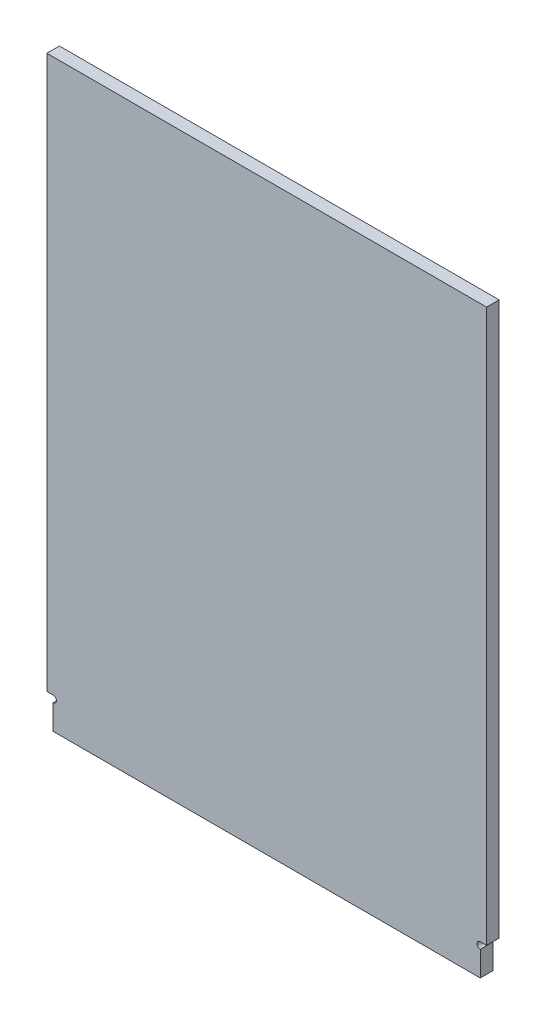
ISO-10303-21;
HEADER;
FILE_DESCRIPTION(('STEP AP214'),'2;1');
FILE_NAME('part.step','',(''),(''),'','','');
FILE_SCHEMA(('AUTOMOTIVE_DESIGN { 1 0 10303 214 1 1 1 1 }'));
ENDSEC;
DATA;
#1=APPLICATION_CONTEXT('core data for automotive mechanical design processes');
#2=APPLICATION_PROTOCOL_DEFINITION('international standard','automotive_design',2000,#1);
#3=PRODUCT_CONTEXT('',#1,'mechanical');
#4=PRODUCT('Part','Part','',(#3));
#5=PRODUCT_RELATED_PRODUCT_CATEGORY('part','',(#4));
#6=PRODUCT_DEFINITION_FORMATION('','',#4);
#7=PRODUCT_DEFINITION_CONTEXT('part definition',#1,'design');
#8=PRODUCT_DEFINITION('design','',#6,#7);
#9=PRODUCT_DEFINITION_SHAPE('','',#8);
#10=(LENGTH_UNIT() NAMED_UNIT(*) SI_UNIT(.MILLI.,.METRE.));
#11=(NAMED_UNIT(*) PLANE_ANGLE_UNIT() SI_UNIT($,.RADIAN.));
#12=(NAMED_UNIT(*) SI_UNIT($,.STERADIAN.) SOLID_ANGLE_UNIT());
#13=UNCERTAINTY_MEASURE_WITH_UNIT(LENGTH_MEASURE(1.E-05),#10,'distance_accuracy_value','');
#14=(GEOMETRIC_REPRESENTATION_CONTEXT(3) GLOBAL_UNCERTAINTY_ASSIGNED_CONTEXT((#13)) GLOBAL_UNIT_ASSIGNED_CONTEXT((#10,
#11,#12)) REPRESENTATION_CONTEXT('',''));
#15=CARTESIAN_POINT('',(0.,0.,0.));
#16=DIRECTION('',(0.,0.,1.));
#17=DIRECTION('',(1.,0.,0.));
#18=AXIS2_PLACEMENT_3D('',#15,#16,#17);
#19=CARTESIAN_POINT('',(0.,0.,12.7));
#20=DIRECTION('',(0.,0.,1.));
#21=DIRECTION('',(1.,0.,0.));
#22=AXIS2_PLACEMENT_3D('',#19,#20,#21);
#23=PLANE('',#22);
#24=DIRECTION('',(0.,1.,0.));
#25=VECTOR('',#24,1.);
#26=CARTESIAN_POINT('',(-215.9,0.,12.7));
#27=LINE('',#26,#25);
#28=CARTESIAN_POINT('',(-215.9,-298.45,12.7));
#29=VERTEX_POINT('',#28);
#30=CARTESIAN_POINT('',(-215.9,-273.304,12.7));
#31=VERTEX_POINT('',#30);
#32=EDGE_CURVE('E154',#29,#31,#27,.T.);
#33=ORIENTED_EDGE('',*,*,#32,.F.);
#34=DIRECTION('',(-1.,0.,0.));
#35=VECTOR('',#34,1.);
#36=CARTESIAN_POINT('',(-222.25,-298.45,12.7));
#37=LINE('',#36,#35);
#38=CARTESIAN_POINT('',(215.9,-298.45,12.7));
#39=VERTEX_POINT('',#38);
#40=EDGE_CURVE('E145',#39,#29,#37,.T.);
#41=ORIENTED_EDGE('',*,*,#40,.F.);
#42=DIRECTION('',(0.,1.,0.));
#43=VECTOR('',#42,1.);
#44=CARTESIAN_POINT('',(215.9,0.,12.7));
#45=LINE('',#44,#43);
#46=CARTESIAN_POINT('',(215.9,-273.304,12.7));
#47=VERTEX_POINT('',#46);
#48=EDGE_CURVE('E151',#39,#47,#45,.T.);
#49=ORIENTED_EDGE('',*,*,#48,.T.);
#50=CARTESIAN_POINT('',(215.9,-270.002,12.7));
#51=DIRECTION('',(0.,0.,-1.));
#52=DIRECTION('',(-1.,0.,0.));
#53=AXIS2_PLACEMENT_3D('',#50,#51,#52);
#54=CIRCLE('',#53,3.30200000000001);
#55=CARTESIAN_POINT('',(215.9,-266.7,12.7));
#56=VERTEX_POINT('',#55);
#57=EDGE_CURVE('E165',#47,#56,#54,.T.);
#58=ORIENTED_EDGE('',*,*,#57,.T.);
#59=DIRECTION('',(-1.,0.,0.));
#60=VECTOR('',#59,1.);
#61=CARTESIAN_POINT('',(0.,-266.7,12.7));
#62=LINE('',#61,#60);
#63=CARTESIAN_POINT('',(222.25,-266.7,12.7));
#64=VERTEX_POINT('',#63);
#65=EDGE_CURVE('E159',#64,#56,#62,.T.);
#66=ORIENTED_EDGE('',*,*,#65,.F.);
#67=DIRECTION('',(0.,1.,0.));
#68=VECTOR('',#67,1.);
#69=CARTESIAN_POINT('',(222.25,-304.8,12.7));
#70=LINE('',#69,#68);
#71=CARTESIAN_POINT('',(222.25,292.1,12.7));
#72=VERTEX_POINT('',#71);
#73=EDGE_CURVE('E77',#64,#72,#70,.T.);
#74=ORIENTED_EDGE('',*,*,#73,.T.);
#75=DIRECTION('',(1.,0.,0.));
#76=VECTOR('',#75,1.);
#77=CARTESIAN_POINT('',(0.,292.1,12.7));
#78=LINE('',#77,#76);
#79=CARTESIAN_POINT('',(-222.25,292.1,12.7));
#80=VERTEX_POINT('',#79);
#81=EDGE_CURVE('E190',#80,#72,#78,.T.);
#82=ORIENTED_EDGE('',*,*,#81,.F.);
#83=DIRECTION('',(0.,-1.,0.));
#84=VECTOR('',#83,1.);
#85=CARTESIAN_POINT('',(-222.25,-304.8,12.7));
#86=LINE('',#85,#84);
#87=CARTESIAN_POINT('',(-222.25,-266.7,12.7));
#88=VERTEX_POINT('',#87);
#89=EDGE_CURVE('E205',#80,#88,#86,.T.);
#90=ORIENTED_EDGE('',*,*,#89,.T.);
#91=DIRECTION('',(1.,0.,0.));
#92=VECTOR('',#91,1.);
#93=CARTESIAN_POINT('',(0.,-266.7,12.7));
#94=LINE('',#93,#92);
#95=CARTESIAN_POINT('',(-215.9,-266.7,12.7));
#96=VERTEX_POINT('',#95);
#97=EDGE_CURVE('E182',#88,#96,#94,.T.);
#98=ORIENTED_EDGE('',*,*,#97,.T.);
#99=CARTESIAN_POINT('',(-215.9,-270.002,12.7));
#100=DIRECTION('',(0.,0.,1.));
#101=DIRECTION('',(1.,0.,0.));
#102=AXIS2_PLACEMENT_3D('',#99,#100,#101);
#103=CIRCLE('',#102,3.30200000000001);
#104=EDGE_CURVE('E173',#31,#96,#103,.T.);
#105=ORIENTED_EDGE('',*,*,#104,.F.);
#106=EDGE_LOOP('',(#33,#41,#49,#58,#66,#74,#82,#90,#98,#105));
#107=FACE_BOUND('',#106,.T.);
#108=ADVANCED_FACE('F69',(#107),#23,.T.);
#109=CARTESIAN_POINT('',(0.,0.,0.));
#110=DIRECTION('',(0.,0.,1.));
#111=DIRECTION('',(1.,0.,0.));
#112=AXIS2_PLACEMENT_3D('',#109,#110,#111);
#113=PLANE('',#112);
#114=DIRECTION('',(1.,0.,0.));
#115=VECTOR('',#114,1.);
#116=CARTESIAN_POINT('',(-222.25,-298.45,0.));
#117=LINE('',#116,#115);
#118=CARTESIAN_POINT('',(-215.9,-298.45,0.));
#119=VERTEX_POINT('',#118);
#120=CARTESIAN_POINT('',(215.9,-298.45,0.));
#121=VERTEX_POINT('',#120);
#122=EDGE_CURVE('E84',#119,#121,#117,.T.);
#123=ORIENTED_EDGE('',*,*,#122,.F.);
#124=DIRECTION('',(0.,1.,0.));
#125=VECTOR('',#124,1.);
#126=CARTESIAN_POINT('',(-215.9,0.,0.));
#127=LINE('',#126,#125);
#128=CARTESIAN_POINT('',(-215.9,-273.304,0.));
#129=VERTEX_POINT('',#128);
#130=EDGE_CURVE('E179',#119,#129,#127,.T.);
#131=ORIENTED_EDGE('',*,*,#130,.T.);
#132=CARTESIAN_POINT('',(-215.9,-270.002,0.));
#133=DIRECTION('',(0.,0.,1.));
#134=DIRECTION('',(1.,0.,0.));
#135=AXIS2_PLACEMENT_3D('',#132,#133,#134);
#136=CIRCLE('',#135,3.30200000000001);
#137=CARTESIAN_POINT('',(-215.9,-266.7,0.));
#138=VERTEX_POINT('',#137);
#139=EDGE_CURVE('E185',#129,#138,#136,.T.);
#140=ORIENTED_EDGE('',*,*,#139,.T.);
#141=DIRECTION('',(1.,0.,0.));
#142=VECTOR('',#141,1.);
#143=CARTESIAN_POINT('',(0.,-266.7,0.));
#144=LINE('',#143,#142);
#145=CARTESIAN_POINT('',(-222.25,-266.7,0.));
#146=VERTEX_POINT('',#145);
#147=EDGE_CURVE('E177',#146,#138,#144,.T.);
#148=ORIENTED_EDGE('',*,*,#147,.F.);
#149=DIRECTION('',(0.,-1.,0.));
#150=VECTOR('',#149,1.);
#151=CARTESIAN_POINT('',(-222.25,-304.8,0.));
#152=LINE('',#151,#150);
#153=CARTESIAN_POINT('',(-222.25,292.1,0.));
#154=VERTEX_POINT('',#153);
#155=EDGE_CURVE('E202',#154,#146,#152,.T.);
#156=ORIENTED_EDGE('',*,*,#155,.F.);
#157=DIRECTION('',(1.,0.,0.));
#158=VECTOR('',#157,1.);
#159=CARTESIAN_POINT('',(0.,292.1,0.));
#160=LINE('',#159,#158);
#161=CARTESIAN_POINT('',(222.25,292.1,0.));
#162=VERTEX_POINT('',#161);
#163=EDGE_CURVE('E199',#154,#162,#160,.T.);
#164=ORIENTED_EDGE('',*,*,#163,.T.);
#165=DIRECTION('',(0.,1.,0.));
#166=VECTOR('',#165,1.);
#167=CARTESIAN_POINT('',(222.25,-304.8,0.));
#168=LINE('',#167,#166);
#169=CARTESIAN_POINT('',(222.25,-266.7,0.));
#170=VERTEX_POINT('',#169);
#171=EDGE_CURVE('E207',#170,#162,#168,.T.);
#172=ORIENTED_EDGE('',*,*,#171,.F.);
#173=DIRECTION('',(-1.,0.,0.));
#174=VECTOR('',#173,1.);
#175=CARTESIAN_POINT('',(0.,-266.7,0.));
#176=LINE('',#175,#174);
#177=CARTESIAN_POINT('',(215.9,-266.7,0.));
#178=VERTEX_POINT('',#177);
#179=EDGE_CURVE('E168',#170,#178,#176,.T.);
#180=ORIENTED_EDGE('',*,*,#179,.T.);
#181=CARTESIAN_POINT('',(215.9,-270.002,0.));
#182=DIRECTION('',(0.,0.,-1.));
#183=DIRECTION('',(-1.,0.,0.));
#184=AXIS2_PLACEMENT_3D('',#181,#182,#183);
#185=CIRCLE('',#184,3.30200000000001);
#186=CARTESIAN_POINT('',(215.9,-273.304,0.));
#187=VERTEX_POINT('',#186);
#188=EDGE_CURVE('E160',#187,#178,#185,.T.);
#189=ORIENTED_EDGE('',*,*,#188,.F.);
#190=DIRECTION('',(0.,1.,0.));
#191=VECTOR('',#190,1.);
#192=CARTESIAN_POINT('',(215.9,0.,0.));
#193=LINE('',#192,#191);
#194=EDGE_CURVE('E90',#121,#187,#193,.T.);
#195=ORIENTED_EDGE('',*,*,#194,.F.);
#196=EDGE_LOOP('',(#123,#131,#140,#148,#156,#164,#172,#180,#189,#195));
#197=FACE_BOUND('',#196,.T.);
#198=ADVANCED_FACE('F220',(#197),#113,.F.);
#199=CARTESIAN_POINT('',(-215.9,0.,0.));
#200=DIRECTION('',(1.,0.,0.));
#201=DIRECTION('',(0.,0.,-1.));
#202=AXIS2_PLACEMENT_3D('',#199,#200,#201);
#203=PLANE('',#202);
#204=DIRECTION('',(0.,0.,-1.));
#205=VECTOR('',#204,1.);
#206=CARTESIAN_POINT('',(-215.9,-298.45,0.));
#207=LINE('',#206,#205);
#208=EDGE_CURVE('E155',#29,#119,#207,.T.);
#209=ORIENTED_EDGE('',*,*,#208,.F.);
#210=ORIENTED_EDGE('',*,*,#32,.T.);
#211=DIRECTION('',(0.,0.,1.));
#212=VECTOR('',#211,1.);
#213=CARTESIAN_POINT('',(-215.9,-273.304,0.));
#214=LINE('',#213,#212);
#215=EDGE_CURVE('E187',#129,#31,#214,.T.);
#216=ORIENTED_EDGE('',*,*,#215,.F.);
#217=ORIENTED_EDGE('',*,*,#130,.F.);
#218=EDGE_LOOP('',(#209,#210,#216,#217));
#219=FACE_BOUND('',#218,.T.);
#220=ADVANCED_FACE('F250',(#219),#203,.F.);
#221=CARTESIAN_POINT('',(215.9,0.,0.));
#222=DIRECTION('',(1.,0.,0.));
#223=DIRECTION('',(0.,0.,-1.));
#224=AXIS2_PLACEMENT_3D('',#221,#222,#223);
#225=PLANE('',#224);
#226=ORIENTED_EDGE('',*,*,#48,.F.);
#227=DIRECTION('',(0.,0.,-1.));
#228=VECTOR('',#227,1.);
#229=CARTESIAN_POINT('',(215.9,-298.45,0.));
#230=LINE('',#229,#228);
#231=EDGE_CURVE('E12',#39,#121,#230,.T.);
#232=ORIENTED_EDGE('',*,*,#231,.T.);
#233=ORIENTED_EDGE('',*,*,#194,.T.);
#234=DIRECTION('',(0.,0.,1.));
#235=VECTOR('',#234,1.);
#236=CARTESIAN_POINT('',(215.9,-273.304,0.));
#237=LINE('',#236,#235);
#238=EDGE_CURVE('E158',#187,#47,#237,.T.);
#239=ORIENTED_EDGE('',*,*,#238,.T.);
#240=EDGE_LOOP('',(#226,#232,#233,#239));
#241=FACE_BOUND('',#240,.T.);
#242=ADVANCED_FACE('F157',(#241),#225,.T.);
#243=CARTESIAN_POINT('',(-222.25,-304.8,12.7));
#244=DIRECTION('',(1.,0.,0.));
#245=DIRECTION('',(0.,0.,-1.));
#246=AXIS2_PLACEMENT_3D('',#243,#244,#245);
#247=PLANE('',#246);
#248=DIRECTION('',(0.,0.,1.));
#249=VECTOR('',#248,1.);
#250=CARTESIAN_POINT('',(-222.25,-266.7,0.));
#251=LINE('',#250,#249);
#252=EDGE_CURVE('E191',#146,#88,#251,.T.);
#253=ORIENTED_EDGE('',*,*,#252,.T.);
#254=ORIENTED_EDGE('',*,*,#89,.F.);
#255=DIRECTION('',(0.,0.,1.));
#256=VECTOR('',#255,1.);
#257=CARTESIAN_POINT('',(-222.25,292.1,0.));
#258=LINE('',#257,#256);
#259=EDGE_CURVE('E226',#154,#80,#258,.T.);
#260=ORIENTED_EDGE('',*,*,#259,.F.);
#261=ORIENTED_EDGE('',*,*,#155,.T.);
#262=EDGE_LOOP('',(#253,#254,#260,#261));
#263=FACE_BOUND('',#262,.T.);
#264=ADVANCED_FACE('F71',(#263),#247,.F.);
#265=CARTESIAN_POINT('',(222.25,-304.8,12.7));
#266=DIRECTION('',(-1.,0.,0.));
#267=DIRECTION('',(0.,0.,1.));
#268=AXIS2_PLACEMENT_3D('',#265,#266,#267);
#269=PLANE('',#268);
#270=ORIENTED_EDGE('',*,*,#171,.T.);
#271=DIRECTION('',(0.,0.,1.));
#272=VECTOR('',#271,1.);
#273=CARTESIAN_POINT('',(222.25,292.1,0.));
#274=LINE('',#273,#272);
#275=EDGE_CURVE('E216',#162,#72,#274,.T.);
#276=ORIENTED_EDGE('',*,*,#275,.T.);
#277=ORIENTED_EDGE('',*,*,#73,.F.);
#278=DIRECTION('',(0.,0.,1.));
#279=VECTOR('',#278,1.);
#280=CARTESIAN_POINT('',(222.25,-266.7,0.));
#281=LINE('',#280,#279);
#282=EDGE_CURVE('E174',#170,#64,#281,.T.);
#283=ORIENTED_EDGE('',*,*,#282,.F.);
#284=EDGE_LOOP('',(#270,#276,#277,#283));
#285=FACE_BOUND('',#284,.T.);
#286=ADVANCED_FACE('F213',(#285),#269,.F.);
#287=CARTESIAN_POINT('',(0.,292.1,0.));
#288=DIRECTION('',(0.,-1.,0.));
#289=DIRECTION('',(0.,0.,-1.));
#290=AXIS2_PLACEMENT_3D('',#287,#288,#289);
#291=PLANE('',#290);
#292=ORIENTED_EDGE('',*,*,#81,.T.);
#293=ORIENTED_EDGE('',*,*,#275,.F.);
#294=ORIENTED_EDGE('',*,*,#163,.F.);
#295=ORIENTED_EDGE('',*,*,#259,.T.);
#296=EDGE_LOOP('',(#292,#293,#294,#295));
#297=FACE_BOUND('',#296,.T.);
#298=ADVANCED_FACE('F225',(#297),#291,.F.);
#299=CARTESIAN_POINT('',(0.,-266.7,0.));
#300=DIRECTION('',(0.,-1.,0.));
#301=DIRECTION('',(0.,0.,-1.));
#302=AXIS2_PLACEMENT_3D('',#299,#300,#301);
#303=PLANE('',#302);
#304=ORIENTED_EDGE('',*,*,#97,.F.);
#305=ORIENTED_EDGE('',*,*,#252,.F.);
#306=ORIENTED_EDGE('',*,*,#147,.T.);
#307=DIRECTION('',(0.,0.,1.));
#308=VECTOR('',#307,1.);
#309=CARTESIAN_POINT('',(-215.9,-266.7,0.));
#310=LINE('',#309,#308);
#311=EDGE_CURVE('E181',#138,#96,#310,.T.);
#312=ORIENTED_EDGE('',*,*,#311,.T.);
#313=EDGE_LOOP('',(#304,#305,#306,#312));
#314=FACE_BOUND('',#313,.T.);
#315=ADVANCED_FACE('F242',(#314),#303,.T.);
#316=CARTESIAN_POINT('',(-215.9,-270.002,0.));
#317=DIRECTION('',(0.,0.,1.));
#318=DIRECTION('',(1.,0.,0.));
#319=AXIS2_PLACEMENT_3D('',#316,#317,#318);
#320=CYLINDRICAL_SURFACE('',#319,3.30200000000001);
#321=ORIENTED_EDGE('',*,*,#104,.T.);
#322=ORIENTED_EDGE('',*,*,#311,.F.);
#323=ORIENTED_EDGE('',*,*,#139,.F.);
#324=ORIENTED_EDGE('',*,*,#215,.T.);
#325=EDGE_LOOP('',(#321,#322,#323,#324));
#326=FACE_BOUND('',#325,.T.);
#327=ADVANCED_FACE('F248',(#326),#320,.F.);
#328=CARTESIAN_POINT('',(0.,-266.7,0.));
#329=DIRECTION('',(0.,1.,0.));
#330=DIRECTION('',(0.,0.,1.));
#331=AXIS2_PLACEMENT_3D('',#328,#329,#330);
#332=PLANE('',#331);
#333=ORIENTED_EDGE('',*,*,#65,.T.);
#334=DIRECTION('',(0.,0.,1.));
#335=VECTOR('',#334,1.);
#336=CARTESIAN_POINT('',(215.9,-266.7,0.));
#337=LINE('',#336,#335);
#338=EDGE_CURVE('E171',#178,#56,#337,.T.);
#339=ORIENTED_EDGE('',*,*,#338,.F.);
#340=ORIENTED_EDGE('',*,*,#179,.F.);
#341=ORIENTED_EDGE('',*,*,#282,.T.);
#342=EDGE_LOOP('',(#333,#339,#340,#341));
#343=FACE_BOUND('',#342,.T.);
#344=ADVANCED_FACE('F233',(#343),#332,.F.);
#345=CARTESIAN_POINT('',(215.9,-270.002,0.));
#346=DIRECTION('',(0.,0.,1.));
#347=DIRECTION('',(1.,0.,0.));
#348=AXIS2_PLACEMENT_3D('',#345,#346,#347);
#349=CYLINDRICAL_SURFACE('',#348,3.30200000000001);
#350=ORIENTED_EDGE('',*,*,#57,.F.);
#351=ORIENTED_EDGE('',*,*,#238,.F.);
#352=ORIENTED_EDGE('',*,*,#188,.T.);
#353=ORIENTED_EDGE('',*,*,#338,.T.);
#354=EDGE_LOOP('',(#350,#351,#352,#353));
#355=FACE_BOUND('',#354,.T.);
#356=ADVANCED_FACE('F236',(#355),#349,.F.);
#357=CARTESIAN_POINT('',(0.,-298.45,0.));
#358=DIRECTION('',(0.,-1.,0.));
#359=DIRECTION('',(1.,0.,0.));
#360=AXIS2_PLACEMENT_3D('',#357,#358,#359);
#361=PLANE('',#360);
#362=ORIENTED_EDGE('',*,*,#208,.T.);
#363=ORIENTED_EDGE('',*,*,#122,.T.);
#364=ORIENTED_EDGE('',*,*,#231,.F.);
#365=ORIENTED_EDGE('',*,*,#40,.T.);
#366=EDGE_LOOP('',(#362,#363,#364,#365));
#367=FACE_BOUND('',#366,.T.);
#368=ADVANCED_FACE('F144',(#367),#361,.T.);
#369=CLOSED_SHELL('',(#108,#198,#220,#242,#264,#286,#298,#315,#327,#344,#356,#368));
#370=MANIFOLD_SOLID_BREP('B2',#369);
#371=ADVANCED_BREP_SHAPE_REPRESENTATION('',(#18,#370),#14);
#372=SHAPE_DEFINITION_REPRESENTATION(#9,#371);
ENDSEC;
END-ISO-10303-21;
